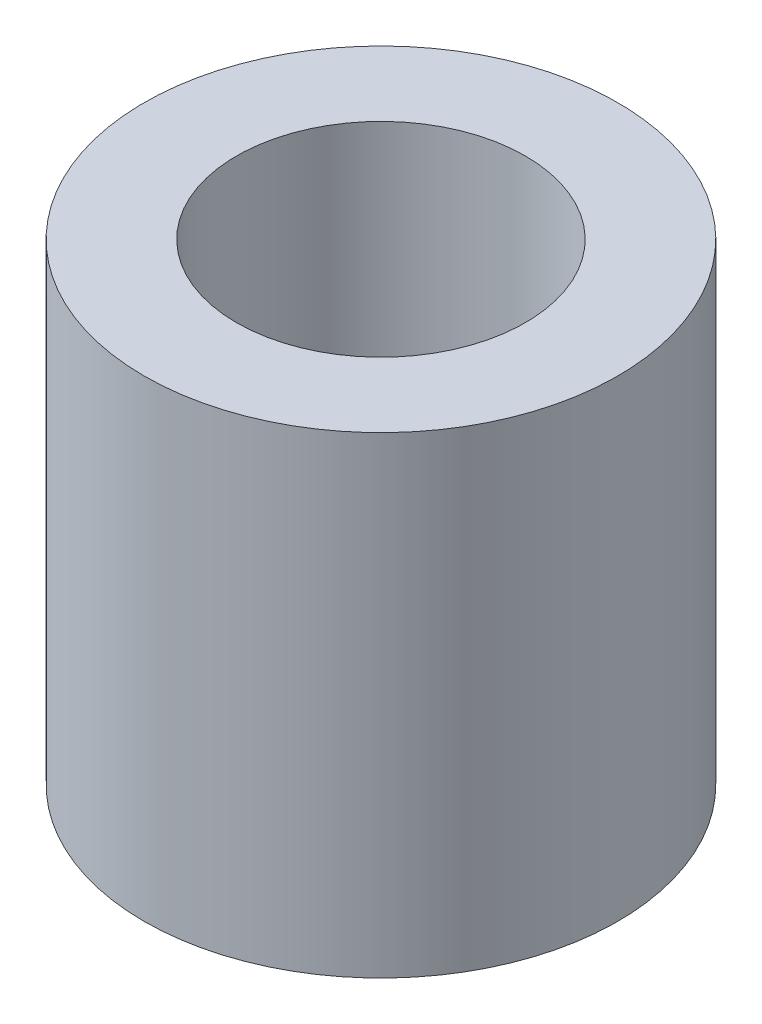
ISO-10303-21;
HEADER;
FILE_DESCRIPTION(('STEP AP214'),'2;1');
FILE_NAME('part.step','',(''),(''),'','','');
FILE_SCHEMA(('AUTOMOTIVE_DESIGN { 1 0 10303 214 1 1 1 1 }'));
ENDSEC;
DATA;
#1=APPLICATION_CONTEXT('core data for automotive mechanical design processes');
#2=APPLICATION_PROTOCOL_DEFINITION('international standard','automotive_design',2000,#1);
#3=PRODUCT_CONTEXT('',#1,'mechanical');
#4=PRODUCT('Part','Part','',(#3));
#5=PRODUCT_RELATED_PRODUCT_CATEGORY('part','',(#4));
#6=PRODUCT_DEFINITION_FORMATION('','',#4);
#7=PRODUCT_DEFINITION_CONTEXT('part definition',#1,'design');
#8=PRODUCT_DEFINITION('design','',#6,#7);
#9=PRODUCT_DEFINITION_SHAPE('','',#8);
#10=(LENGTH_UNIT() NAMED_UNIT(*) SI_UNIT(.MILLI.,.METRE.));
#11=(NAMED_UNIT(*) PLANE_ANGLE_UNIT() SI_UNIT($,.RADIAN.));
#12=(NAMED_UNIT(*) SI_UNIT($,.STERADIAN.) SOLID_ANGLE_UNIT());
#13=UNCERTAINTY_MEASURE_WITH_UNIT(LENGTH_MEASURE(1.E-05),#10,'distance_accuracy_value','');
#14=(GEOMETRIC_REPRESENTATION_CONTEXT(3) GLOBAL_UNCERTAINTY_ASSIGNED_CONTEXT((#13)) GLOBAL_UNIT_ASSIGNED_CONTEXT((#10,
#11,#12)) REPRESENTATION_CONTEXT('',''));
#15=CARTESIAN_POINT('',(0.,0.,0.));
#16=DIRECTION('',(0.,0.,1.));
#17=DIRECTION('',(1.,0.,0.));
#18=AXIS2_PLACEMENT_3D('',#15,#16,#17);
#19=CARTESIAN_POINT('',(0.,9.975,0.));
#20=DIRECTION('',(0.,1.,0.));
#21=DIRECTION('',(0.,0.,1.));
#22=AXIS2_PLACEMENT_3D('',#19,#20,#21);
#23=PLANE('',#22);
#24=CARTESIAN_POINT('',(0.,9.975,0.));
#25=DIRECTION('',(0.,1.,0.));
#26=DIRECTION('',(0.,0.,1.));
#27=AXIS2_PLACEMENT_3D('',#24,#25,#26);
#28=CIRCLE('',#27,10.);
#29=CARTESIAN_POINT('',(0.,9.975,10.));
#30=VERTEX_POINT('',#29);
#31=EDGE_CURVE('E10',#30,#30,#28,.T.);
#32=ORIENTED_EDGE('',*,*,#31,.T.);
#33=EDGE_LOOP('',(#32));
#34=FACE_BOUND('',#33,.T.);
#35=CARTESIAN_POINT('',(0.,9.975,0.));
#36=DIRECTION('',(0.,1.,0.));
#37=DIRECTION('',(0.,0.,1.));
#38=AXIS2_PLACEMENT_3D('',#35,#36,#37);
#39=CIRCLE('',#38,6.1);
#40=CARTESIAN_POINT('',(0.,9.975,6.1));
#41=VERTEX_POINT('',#40);
#42=EDGE_CURVE('E50',#41,#41,#39,.T.);
#43=ORIENTED_EDGE('',*,*,#42,.F.);
#44=EDGE_LOOP('',(#43));
#45=FACE_BOUND('',#44,.T.);
#46=ADVANCED_FACE('F37',(#34,#45),#23,.T.);
#47=CARTESIAN_POINT('',(0.,-9.975,0.));
#48=DIRECTION('',(0.,1.,0.));
#49=DIRECTION('',(0.,0.,1.));
#50=AXIS2_PLACEMENT_3D('',#47,#48,#49);
#51=PLANE('',#50);
#52=CARTESIAN_POINT('',(0.,-9.975,0.));
#53=DIRECTION('',(0.,1.,0.));
#54=DIRECTION('',(0.,0.,1.));
#55=AXIS2_PLACEMENT_3D('',#52,#53,#54);
#56=CIRCLE('',#55,10.);
#57=CARTESIAN_POINT('',(0.,-9.975,10.));
#58=VERTEX_POINT('',#57);
#59=EDGE_CURVE('E41',#58,#58,#56,.T.);
#60=ORIENTED_EDGE('',*,*,#59,.F.);
#61=EDGE_LOOP('',(#60));
#62=FACE_BOUND('',#61,.T.);
#63=CARTESIAN_POINT('',(0.,-9.975,0.));
#64=DIRECTION('',(0.,1.,0.));
#65=DIRECTION('',(0.,0.,1.));
#66=AXIS2_PLACEMENT_3D('',#63,#64,#65);
#67=CIRCLE('',#66,6.1);
#68=CARTESIAN_POINT('',(0.,-9.975,6.1));
#69=VERTEX_POINT('',#68);
#70=EDGE_CURVE('E52',#69,#69,#67,.T.);
#71=ORIENTED_EDGE('',*,*,#70,.T.);
#72=EDGE_LOOP('',(#71));
#73=FACE_BOUND('',#72,.T.);
#74=ADVANCED_FACE('F64',(#62,#73),#51,.F.);
#75=CARTESIAN_POINT('',(0.,9.975,0.));
#76=DIRECTION('',(0.,-1.,0.));
#77=DIRECTION('',(0.,0.,-1.));
#78=AXIS2_PLACEMENT_3D('',#75,#76,#77);
#79=CYLINDRICAL_SURFACE('',#78,10.);
#80=ORIENTED_EDGE('',*,*,#31,.F.);
#81=EDGE_LOOP('',(#80));
#82=FACE_BOUND('',#81,.T.);
#83=ORIENTED_EDGE('',*,*,#59,.T.);
#84=EDGE_LOOP('',(#83));
#85=FACE_BOUND('',#84,.T.);
#86=ADVANCED_FACE('F39',(#82,#85),#79,.T.);
#87=CARTESIAN_POINT('',(0.,9.975,0.));
#88=DIRECTION('',(0.,-1.,0.));
#89=DIRECTION('',(0.,0.,-1.));
#90=AXIS2_PLACEMENT_3D('',#87,#88,#89);
#91=CYLINDRICAL_SURFACE('',#90,6.1);
#92=ORIENTED_EDGE('',*,*,#42,.T.);
#93=EDGE_LOOP('',(#92));
#94=FACE_BOUND('',#93,.T.);
#95=ORIENTED_EDGE('',*,*,#70,.F.);
#96=EDGE_LOOP('',(#95));
#97=FACE_BOUND('',#96,.T.);
#98=ADVANCED_FACE('F60',(#94,#97),#91,.F.);
#99=CLOSED_SHELL('',(#46,#74,#86,#98));
#100=MANIFOLD_SOLID_BREP('B2',#99);
#101=ADVANCED_BREP_SHAPE_REPRESENTATION('',(#18,#100),#14);
#102=SHAPE_DEFINITION_REPRESENTATION(#9,#101);
ENDSEC;
END-ISO-10303-21;
